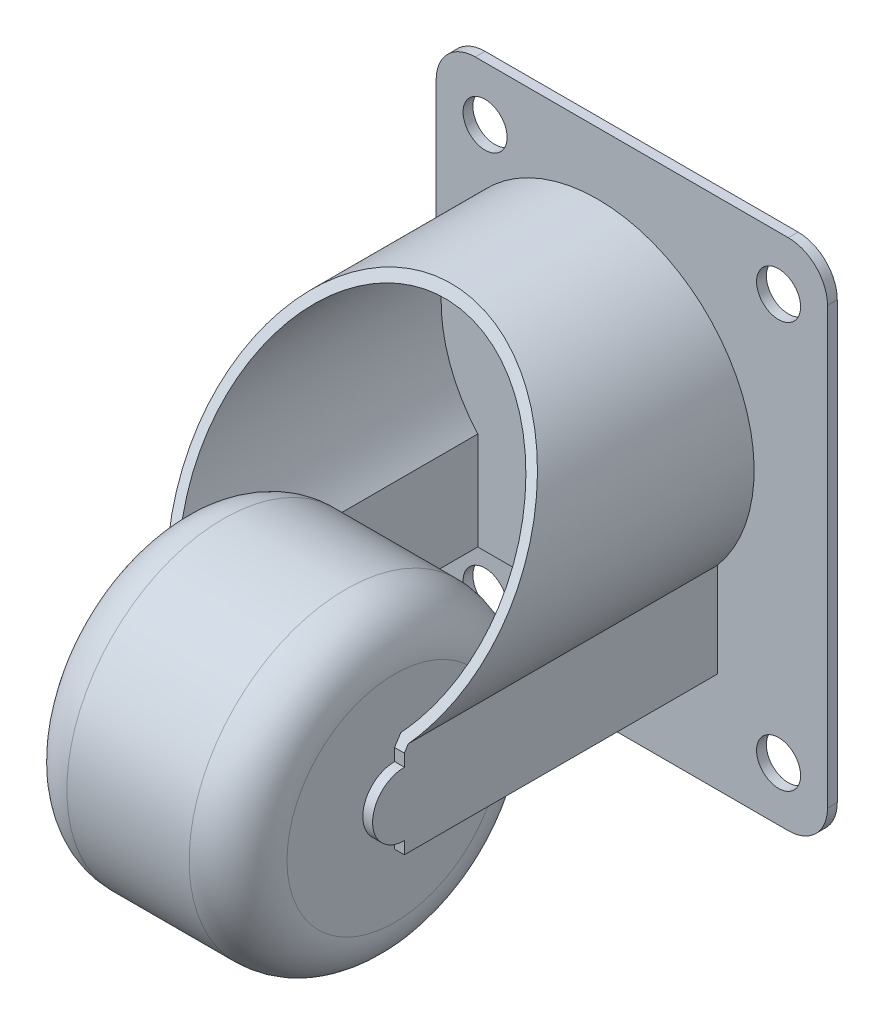
ISO-10303-21;
HEADER;
FILE_DESCRIPTION(('STEP AP214'),'2;1');
FILE_NAME('part.step','',(''),(''),'','','');
FILE_SCHEMA(('AUTOMOTIVE_DESIGN { 1 0 10303 214 1 1 1 1 }'));
ENDSEC;
DATA;
#1=APPLICATION_CONTEXT('core data for automotive mechanical design processes');
#2=APPLICATION_PROTOCOL_DEFINITION('international standard','automotive_design',2000,#1);
#3=PRODUCT_CONTEXT('',#1,'mechanical');
#4=PRODUCT('Part','Part','',(#3));
#5=PRODUCT_RELATED_PRODUCT_CATEGORY('part','',(#4));
#6=PRODUCT_DEFINITION_FORMATION('','',#4);
#7=PRODUCT_DEFINITION_CONTEXT('part definition',#1,'design');
#8=PRODUCT_DEFINITION('design','',#6,#7);
#9=PRODUCT_DEFINITION_SHAPE('','',#8);
#10=(LENGTH_UNIT() NAMED_UNIT(*) SI_UNIT(.MILLI.,.METRE.));
#11=(NAMED_UNIT(*) PLANE_ANGLE_UNIT() SI_UNIT($,.RADIAN.));
#12=(NAMED_UNIT(*) SI_UNIT($,.STERADIAN.) SOLID_ANGLE_UNIT());
#13=UNCERTAINTY_MEASURE_WITH_UNIT(LENGTH_MEASURE(1.E-05),#10,'distance_accuracy_value','');
#14=(GEOMETRIC_REPRESENTATION_CONTEXT(3) GLOBAL_UNCERTAINTY_ASSIGNED_CONTEXT((#13)) GLOBAL_UNIT_ASSIGNED_CONTEXT((#10,
#11,#12)) REPRESENTATION_CONTEXT('',''));
#15=CARTESIAN_POINT('',(0.,0.,0.));
#16=DIRECTION('',(0.,0.,1.));
#17=DIRECTION('',(1.,0.,0.));
#18=AXIS2_PLACEMENT_3D('',#15,#16,#17);
#19=CARTESIAN_POINT('',(0.,9.00000000000001,62.));
#20=DIRECTION('',(1.,0.,0.));
#21=DIRECTION('',(0.,0.,-1.));
#22=AXIS2_PLACEMENT_3D('',#19,#20,#21);
#23=CYLINDRICAL_SURFACE('',#22,32.);
#24=CARTESIAN_POINT('',(35.,9.00000000000001,62.));
#25=DIRECTION('',(1.,0.,0.));
#26=DIRECTION('',(0.,0.,-1.));
#27=AXIS2_PLACEMENT_3D('',#24,#25,#26);
#28=CIRCLE('',#27,32.);
#29=CARTESIAN_POINT('',(35.,9.00000000000001,30.));
#30=VERTEX_POINT('',#29);
#31=EDGE_CURVE('E662',#30,#30,#28,.T.);
#32=ORIENTED_EDGE('',*,*,#31,.F.);
#33=EDGE_LOOP('',(#32));
#34=FACE_BOUND('',#33,.T.);
#35=CARTESIAN_POINT('',(10.,9.00000000000001,62.));
#36=DIRECTION('',(1.,0.,0.));
#37=DIRECTION('',(0.,0.,-1.));
#38=AXIS2_PLACEMENT_3D('',#35,#36,#37);
#39=CIRCLE('',#38,32.);
#40=CARTESIAN_POINT('',(10.,9.00000000000001,30.));
#41=VERTEX_POINT('',#40);
#42=EDGE_CURVE('E180',#41,#41,#39,.F.);
#43=ORIENTED_EDGE('',*,*,#42,.F.);
#44=EDGE_LOOP('',(#43));
#45=FACE_BOUND('',#44,.T.);
#46=ADVANCED_FACE('F16',(#34,#45),#23,.T.);
#47=CARTESIAN_POINT('',(35.,9.00000000000001,62.));
#48=DIRECTION('',(1.,0.,0.));
#49=DIRECTION('',(0.,0.,-1.));
#50=AXIS2_PLACEMENT_3D('',#47,#48,#49);
#51=TOROIDAL_SURFACE('',#50,22.,10.);
#52=CARTESIAN_POINT('',(45.,9.00000000000001,62.));
#53=DIRECTION('',(-1.,0.,0.));
#54=DIRECTION('',(0.,-0.409090909090909,-0.912493631812942));
#55=AXIS2_PLACEMENT_3D('',#52,#53,#54);
#56=CIRCLE('',#55,22.);
#57=CARTESIAN_POINT('',(45.,9.00000000000001,84.));
#58=VERTEX_POINT('',#57);
#59=CARTESIAN_POINT('',(45.,0.,41.9251401001153));
#60=VERTEX_POINT('',#59);
#61=EDGE_CURVE('E206',#58,#60,#56,.F.);
#62=ORIENTED_EDGE('',*,*,#61,.F.);
#63=CARTESIAN_POINT('',(45.,9.00000000000001,62.));
#64=DIRECTION('',(-1.,0.,0.));
#65=DIRECTION('',(0.,0.,1.));
#66=AXIS2_PLACEMENT_3D('',#63,#64,#65);
#67=CIRCLE('',#66,22.);
#68=CARTESIAN_POINT('',(45.,20.,42.9474411167424));
#69=VERTEX_POINT('',#68);
#70=EDGE_CURVE('E167',#69,#58,#67,.F.);
#71=ORIENTED_EDGE('',*,*,#70,.F.);
#72=CARTESIAN_POINT('',(45.,9.00000000000001,62.));
#73=DIRECTION('',(-1.,0.,0.));
#74=DIRECTION('',(0.,0.500000000000001,-0.866025403784438));
#75=AXIS2_PLACEMENT_3D('',#72,#73,#74);
#76=CIRCLE('',#75,22.);
#77=CARTESIAN_POINT('',(45.,9.00000000000001,40.));
#78=VERTEX_POINT('',#77);
#79=EDGE_CURVE('E190',#78,#69,#76,.F.);
#80=ORIENTED_EDGE('',*,*,#79,.F.);
#81=CARTESIAN_POINT('',(45.,9.00000000000001,62.));
#82=DIRECTION('',(-1.,0.,0.));
#83=DIRECTION('',(0.,0.,-1.));
#84=AXIS2_PLACEMENT_3D('',#81,#82,#83);
#85=CIRCLE('',#84,22.);
#86=EDGE_CURVE('E197',#60,#78,#85,.F.);
#87=ORIENTED_EDGE('',*,*,#86,.F.);
#88=EDGE_LOOP('',(#62,#71,#80,#87));
#89=FACE_BOUND('',#88,.T.);
#90=ORIENTED_EDGE('',*,*,#31,.T.);
#91=EDGE_LOOP('',(#90));
#92=FACE_BOUND('',#91,.T.);
#93=ADVANCED_FACE('F204',(#89,#92),#51,.T.);
#94=CARTESIAN_POINT('',(10.,9.00000000000001,62.));
#95=DIRECTION('',(1.,0.,0.));
#96=DIRECTION('',(0.,0.,-1.));
#97=AXIS2_PLACEMENT_3D('',#94,#95,#96);
#98=TOROIDAL_SURFACE('',#97,22.,10.);
#99=ORIENTED_EDGE('',*,*,#42,.T.);
#100=EDGE_LOOP('',(#99));
#101=FACE_BOUND('',#100,.T.);
#102=CARTESIAN_POINT('',(0.,9.00000000000001,62.));
#103=DIRECTION('',(1.,0.,0.));
#104=DIRECTION('',(0.,0.5,-0.866025403784439));
#105=AXIS2_PLACEMENT_3D('',#102,#103,#104);
#106=CIRCLE('',#105,22.);
#107=CARTESIAN_POINT('',(0.,20.,42.9474411167423));
#108=VERTEX_POINT('',#107);
#109=CARTESIAN_POINT('',(0.,9.00000000000001,84.));
#110=VERTEX_POINT('',#109);
#111=EDGE_CURVE('E253',#108,#110,#106,.T.);
#112=ORIENTED_EDGE('',*,*,#111,.T.);
#113=CARTESIAN_POINT('',(0.,9.00000000000001,62.));
#114=DIRECTION('',(1.,0.,0.));
#115=DIRECTION('',(0.,0.,1.));
#116=AXIS2_PLACEMENT_3D('',#113,#114,#115);
#117=CIRCLE('',#116,22.);
#118=CARTESIAN_POINT('',(0.,0.,41.9251401001153));
#119=VERTEX_POINT('',#118);
#120=EDGE_CURVE('E388',#110,#119,#117,.T.);
#121=ORIENTED_EDGE('',*,*,#120,.T.);
#122=CARTESIAN_POINT('',(0.,9.00000000000001,62.));
#123=DIRECTION('',(1.,0.,0.));
#124=DIRECTION('',(0.,-0.409090909090909,-0.912493631812942));
#125=AXIS2_PLACEMENT_3D('',#122,#123,#124);
#126=CIRCLE('',#125,22.);
#127=CARTESIAN_POINT('',(0.,9.00000000000001,40.));
#128=VERTEX_POINT('',#127);
#129=EDGE_CURVE('E429',#128,#119,#126,.F.);
#130=ORIENTED_EDGE('',*,*,#129,.F.);
#131=CARTESIAN_POINT('',(0.,9.00000000000001,62.));
#132=DIRECTION('',(1.,0.,0.));
#133=DIRECTION('',(0.,0.,-1.));
#134=AXIS2_PLACEMENT_3D('',#131,#132,#133);
#135=CIRCLE('',#134,22.);
#136=EDGE_CURVE('E150',#108,#128,#135,.F.);
#137=ORIENTED_EDGE('',*,*,#136,.F.);
#138=EDGE_LOOP('',(#112,#121,#130,#137));
#139=FACE_BOUND('',#138,.T.);
#140=ADVANCED_FACE('F224',(#101,#139),#98,.T.);
#141=CARTESIAN_POINT('',(22.5,39.8431348329844,62.));
#142=DIRECTION('',(0.,0.,-1.));
#143=DIRECTION('',(-1.,0.,0.));
#144=AXIS2_PLACEMENT_3D('',#141,#142,#143);
#145=CYLINDRICAL_SURFACE('',#144,30.);
#146=CARTESIAN_POINT('',(22.5,39.8431348329844,48.1670416197123));
#147=DIRECTION('',(0.,-0.535023730317032,-0.844837030437023));
#148=DIRECTION('',(0.,0.844837030437023,-0.535023730317032));
#149=AXIS2_PLACEMENT_3D('',#146,#147,#148);
#150=ELLIPSE('',#149,35.5098071215953,30.);
#151=CARTESIAN_POINT('',(45.,20.,60.733427368731));
#152=VERTEX_POINT('',#151);
#153=CARTESIAN_POINT('',(0.,20.,60.7334273687311));
#154=VERTEX_POINT('',#153);
#155=EDGE_CURVE('E261',#152,#154,#150,.F.);
#156=ORIENTED_EDGE('',*,*,#155,.T.);
#157=DIRECTION('',(0.,0.,-1.));
#158=VECTOR('',#157,1.);
#159=CARTESIAN_POINT('',(0.,20.,62.));
#160=LINE('',#159,#158);
#161=EDGE_CURVE('E412',#154,#108,#160,.T.);
#162=ORIENTED_EDGE('',*,*,#161,.T.);
#163=DIRECTION('',(0.,0.,-1.));
#164=VECTOR('',#163,1.);
#165=CARTESIAN_POINT('',(0.,20.,62.));
#166=LINE('',#165,#164);
#167=CARTESIAN_POINT('',(0.,20.,0.));
#168=VERTEX_POINT('',#167);
#169=EDGE_CURVE('E441',#168,#108,#166,.F.);
#170=ORIENTED_EDGE('',*,*,#169,.F.);
#171=CARTESIAN_POINT('',(22.5,39.8431348329844,0.));
#172=DIRECTION('',(0.,0.,-1.));
#173=DIRECTION('',(-1.,0.,0.));
#174=AXIS2_PLACEMENT_3D('',#171,#172,#173);
#175=CIRCLE('',#174,30.);
#176=CARTESIAN_POINT('',(45.,20.,0.));
#177=VERTEX_POINT('',#176);
#178=EDGE_CURVE('E141',#168,#177,#175,.T.);
#179=ORIENTED_EDGE('',*,*,#178,.T.);
#180=DIRECTION('',(0.,0.,1.));
#181=VECTOR('',#180,1.);
#182=CARTESIAN_POINT('',(45.,20.,62.));
#183=LINE('',#182,#181);
#184=EDGE_CURVE('E183',#69,#177,#183,.F.);
#185=ORIENTED_EDGE('',*,*,#184,.F.);
#186=DIRECTION('',(0.,0.,-1.));
#187=VECTOR('',#186,1.);
#188=CARTESIAN_POINT('',(45.,20.,62.));
#189=LINE('',#188,#187);
#190=EDGE_CURVE('E172',#152,#69,#189,.T.);
#191=ORIENTED_EDGE('',*,*,#190,.F.);
#192=EDGE_LOOP('',(#156,#162,#170,#179,#185,#191));
#193=FACE_BOUND('',#192,.T.);
#194=ADVANCED_FACE('F185',(#193),#145,.F.);
#195=CARTESIAN_POINT('',(45.,9.00000000000001,62.));
#196=DIRECTION('',(1.,0.,0.));
#197=DIRECTION('',(0.,0.,-1.));
#198=AXIS2_PLACEMENT_3D('',#195,#196,#197);
#199=PLANE('',#198);
#200=ORIENTED_EDGE('',*,*,#70,.T.);
#201=ORIENTED_EDGE('',*,*,#61,.T.);
#202=DIRECTION('',(0.,0.,-1.));
#203=VECTOR('',#202,1.);
#204=CARTESIAN_POINT('',(45.,0.,62.));
#205=LINE('',#204,#203);
#206=CARTESIAN_POINT('',(45.,0.,62.));
#207=VERTEX_POINT('',#206);
#208=EDGE_CURVE('E304',#207,#60,#205,.T.);
#209=ORIENTED_EDGE('',*,*,#208,.F.);
#210=DIRECTION('',(0.,1.,0.));
#211=VECTOR('',#210,1.);
#212=CARTESIAN_POINT('',(45.,39.8431348329844,62.));
#213=LINE('',#212,#211);
#214=CARTESIAN_POINT('',(45.,2.50000000000001,62.));
#215=VERTEX_POINT('',#214);
#216=EDGE_CURVE('E272',#215,#207,#213,.F.);
#217=ORIENTED_EDGE('',*,*,#216,.F.);
#218=CARTESIAN_POINT('',(45.,9.00000000000001,62.));
#219=DIRECTION('',(1.,0.,0.));
#220=DIRECTION('',(0.,0.,-1.));
#221=AXIS2_PLACEMENT_3D('',#218,#219,#220);
#222=CIRCLE('',#221,6.5);
#223=CARTESIAN_POINT('',(45.,15.5,62.));
#224=VERTEX_POINT('',#223);
#225=EDGE_CURVE('E333',#224,#215,#222,.T.);
#226=ORIENTED_EDGE('',*,*,#225,.F.);
#227=DIRECTION('',(0.,1.,0.));
#228=VECTOR('',#227,1.);
#229=CARTESIAN_POINT('',(45.,39.8431348329844,62.));
#230=LINE('',#229,#228);
#231=CARTESIAN_POINT('',(45.,18.,62.));
#232=VERTEX_POINT('',#231);
#233=EDGE_CURVE('E265',#232,#224,#230,.F.);
#234=ORIENTED_EDGE('',*,*,#233,.F.);
#235=DIRECTION('',(0.,0.844837030437023,-0.535023730317032));
#236=VECTOR('',#235,1.);
#237=CARTESIAN_POINT('',(45.,18.,62.));
#238=LINE('',#237,#236);
#239=EDGE_CURVE('E177',#232,#152,#238,.T.);
#240=ORIENTED_EDGE('',*,*,#239,.T.);
#241=ORIENTED_EDGE('',*,*,#190,.T.);
#242=EDGE_LOOP('',(#200,#201,#209,#217,#226,#234,#240,#241));
#243=FACE_BOUND('',#242,.T.);
#244=ADVANCED_FACE('F174',(#243),#199,.T.);
#245=CARTESIAN_POINT('',(45.,0.,62.));
#246=DIRECTION('',(-1.,0.,0.));
#247=DIRECTION('',(0.,0.,1.));
#248=AXIS2_PLACEMENT_3D('',#245,#246,#247);
#249=PLANE('',#248);
#250=DIRECTION('',(0.,1.,0.));
#251=VECTOR('',#250,1.);
#252=CARTESIAN_POINT('',(45.,39.8431348329844,0.));
#253=LINE('',#252,#251);
#254=CARTESIAN_POINT('',(45.,0.,0.));
#255=VERTEX_POINT('',#254);
#256=EDGE_CURVE('E189',#177,#255,#253,.F.);
#257=ORIENTED_EDGE('',*,*,#256,.T.);
#258=DIRECTION('',(0.,0.,-1.));
#259=VECTOR('',#258,1.);
#260=CARTESIAN_POINT('',(45.,0.,62.));
#261=LINE('',#260,#259);
#262=EDGE_CURVE('E307',#60,#255,#261,.T.);
#263=ORIENTED_EDGE('',*,*,#262,.F.);
#264=ORIENTED_EDGE('',*,*,#86,.T.);
#265=ORIENTED_EDGE('',*,*,#79,.T.);
#266=ORIENTED_EDGE('',*,*,#184,.T.);
#267=EDGE_LOOP('',(#257,#263,#264,#265,#266));
#268=FACE_BOUND('',#267,.T.);
#269=ADVANCED_FACE('F194',(#268),#249,.T.);
#270=CARTESIAN_POINT('',(22.5,39.8431348329844,0.));
#271=DIRECTION('',(0.,0.,-1.));
#272=DIRECTION('',(-1.,0.,0.));
#273=AXIS2_PLACEMENT_3D('',#270,#271,#272);
#274=PLANE('',#273);
#275=DIRECTION('',(0.,1.,0.));
#276=VECTOR('',#275,1.);
#277=CARTESIAN_POINT('',(0.,0.,0.));
#278=LINE('',#277,#276);
#279=CARTESIAN_POINT('',(0.,0.,0.));
#280=VERTEX_POINT('',#279);
#281=EDGE_CURVE('E448',#280,#168,#278,.T.);
#282=ORIENTED_EDGE('',*,*,#281,.F.);
#283=DIRECTION('',(1.,0.,0.));
#284=VECTOR('',#283,1.);
#285=CARTESIAN_POINT('',(47.,0.,0.));
#286=LINE('',#285,#284);
#287=EDGE_CURVE('E321',#255,#280,#286,.F.);
#288=ORIENTED_EDGE('',*,*,#287,.F.);
#289=ORIENTED_EDGE('',*,*,#256,.F.);
#290=ORIENTED_EDGE('',*,*,#178,.F.);
#291=EDGE_LOOP('',(#282,#288,#289,#290));
#292=FACE_BOUND('',#291,.T.);
#293=ADVANCED_FACE('F843',(#292),#274,.F.);
#294=CARTESIAN_POINT('',(0.,0.,62.));
#295=DIRECTION('',(1.,0.,0.));
#296=DIRECTION('',(0.,0.,-1.));
#297=AXIS2_PLACEMENT_3D('',#294,#295,#296);
#298=PLANE('',#297);
#299=ORIENTED_EDGE('',*,*,#169,.T.);
#300=ORIENTED_EDGE('',*,*,#136,.T.);
#301=ORIENTED_EDGE('',*,*,#129,.T.);
#302=DIRECTION('',(0.,0.,-1.));
#303=VECTOR('',#302,1.);
#304=CARTESIAN_POINT('',(0.,0.,62.));
#305=LINE('',#304,#303);
#306=EDGE_CURVE('E382',#280,#119,#305,.F.);
#307=ORIENTED_EDGE('',*,*,#306,.F.);
#308=ORIENTED_EDGE('',*,*,#281,.T.);
#309=EDGE_LOOP('',(#299,#300,#301,#307,#308));
#310=FACE_BOUND('',#309,.T.);
#311=ADVANCED_FACE('F405',(#310),#298,.T.);
#312=CARTESIAN_POINT('',(0.,9.00000000000001,62.));
#313=DIRECTION('',(1.,0.,0.));
#314=DIRECTION('',(0.,0.,-1.));
#315=AXIS2_PLACEMENT_3D('',#312,#313,#314);
#316=PLANE('',#315);
#317=ORIENTED_EDGE('',*,*,#161,.F.);
#318=DIRECTION('',(0.,0.844837030437023,-0.535023730317032));
#319=VECTOR('',#318,1.);
#320=CARTESIAN_POINT('',(0.,18.,62.));
#321=LINE('',#320,#319);
#322=CARTESIAN_POINT('',(0.,18.,62.));
#323=VERTEX_POINT('',#322);
#324=EDGE_CURVE('E347',#154,#323,#321,.F.);
#325=ORIENTED_EDGE('',*,*,#324,.T.);
#326=DIRECTION('',(0.,1.,0.));
#327=VECTOR('',#326,1.);
#328=CARTESIAN_POINT('',(0.,39.8431348329844,62.));
#329=LINE('',#328,#327);
#330=CARTESIAN_POINT('',(0.,15.5,62.));
#331=VERTEX_POINT('',#330);
#332=EDGE_CURVE('E258',#331,#323,#329,.T.);
#333=ORIENTED_EDGE('',*,*,#332,.F.);
#334=CARTESIAN_POINT('',(0.,9.00000000000001,62.));
#335=DIRECTION('',(1.,0.,0.));
#336=DIRECTION('',(0.,0.,-1.));
#337=AXIS2_PLACEMENT_3D('',#334,#335,#336);
#338=CIRCLE('',#337,6.5);
#339=CARTESIAN_POINT('',(0.,2.50000000000001,62.));
#340=VERTEX_POINT('',#339);
#341=EDGE_CURVE('E375',#340,#331,#338,.F.);
#342=ORIENTED_EDGE('',*,*,#341,.F.);
#343=DIRECTION('',(0.,1.,0.));
#344=VECTOR('',#343,1.);
#345=CARTESIAN_POINT('',(0.,39.8431348329844,62.));
#346=LINE('',#345,#344);
#347=CARTESIAN_POINT('',(0.,0.,62.));
#348=VERTEX_POINT('',#347);
#349=EDGE_CURVE('E361',#348,#340,#346,.T.);
#350=ORIENTED_EDGE('',*,*,#349,.F.);
#351=DIRECTION('',(0.,0.,-1.));
#352=VECTOR('',#351,1.);
#353=CARTESIAN_POINT('',(0.,0.,62.));
#354=LINE('',#353,#352);
#355=EDGE_CURVE('E370',#119,#348,#354,.F.);
#356=ORIENTED_EDGE('',*,*,#355,.F.);
#357=ORIENTED_EDGE('',*,*,#120,.F.);
#358=ORIENTED_EDGE('',*,*,#111,.F.);
#359=EDGE_LOOP('',(#317,#325,#333,#342,#350,#356,#357,#358));
#360=FACE_BOUND('',#359,.T.);
#361=ADVANCED_FACE('F394',(#360),#316,.F.);
#362=CARTESIAN_POINT('',(-20.3847763108502,9.00000000000001,62.));
#363=DIRECTION('',(1.,0.,0.));
#364=DIRECTION('',(0.,0.,-1.));
#365=AXIS2_PLACEMENT_3D('',#362,#363,#364);
#366=CYLINDRICAL_SURFACE('',#365,6.5);
#367=DIRECTION('',(1.,0.,0.));
#368=VECTOR('',#367,1.);
#369=CARTESIAN_POINT('',(22.5,15.5,62.));
#370=LINE('',#369,#368);
#371=CARTESIAN_POINT('',(-2.,15.5,62.));
#372=VERTEX_POINT('',#371);
#373=EDGE_CURVE('E262',#372,#331,#370,.T.);
#374=ORIENTED_EDGE('',*,*,#373,.F.);
#375=CARTESIAN_POINT('',(-2.,9.00000000000001,62.));
#376=DIRECTION('',(1.,0.,0.));
#377=DIRECTION('',(0.,0.,-1.));
#378=AXIS2_PLACEMENT_3D('',#375,#376,#377);
#379=CIRCLE('',#378,6.5);
#380=CARTESIAN_POINT('',(-2.,2.50000000000001,62.));
#381=VERTEX_POINT('',#380);
#382=EDGE_CURVE('E369',#372,#381,#379,.T.);
#383=ORIENTED_EDGE('',*,*,#382,.T.);
#384=DIRECTION('',(1.,0.,0.));
#385=VECTOR('',#384,1.);
#386=CARTESIAN_POINT('',(22.5,2.50000000000001,62.));
#387=LINE('',#386,#385);
#388=EDGE_CURVE('E373',#340,#381,#387,.F.);
#389=ORIENTED_EDGE('',*,*,#388,.F.);
#390=ORIENTED_EDGE('',*,*,#341,.T.);
#391=EDGE_LOOP('',(#374,#383,#389,#390));
#392=FACE_BOUND('',#391,.T.);
#393=ADVANCED_FACE('F404',(#392),#366,.T.);
#394=CARTESIAN_POINT('',(22.5,39.8431348329844,62.));
#395=DIRECTION('',(0.,0.,1.));
#396=DIRECTION('',(1.,0.,0.));
#397=AXIS2_PLACEMENT_3D('',#394,#395,#396);
#398=PLANE('',#397);
#399=DIRECTION('',(1.,0.,0.));
#400=VECTOR('',#399,1.);
#401=CARTESIAN_POINT('',(47.,0.,62.));
#402=LINE('',#401,#400);
#403=CARTESIAN_POINT('',(-2.,0.,62.));
#404=VERTEX_POINT('',#403);
#405=EDGE_CURVE('E366',#348,#404,#402,.F.);
#406=ORIENTED_EDGE('',*,*,#405,.F.);
#407=ORIENTED_EDGE('',*,*,#349,.T.);
#408=ORIENTED_EDGE('',*,*,#388,.T.);
#409=DIRECTION('',(0.,1.,0.));
#410=VECTOR('',#409,1.);
#411=CARTESIAN_POINT('',(-2.,0.,62.));
#412=LINE('',#411,#410);
#413=EDGE_CURVE('E561',#381,#404,#412,.F.);
#414=ORIENTED_EDGE('',*,*,#413,.T.);
#415=EDGE_LOOP('',(#406,#407,#408,#414));
#416=FACE_BOUND('',#415,.T.);
#417=ADVANCED_FACE('F763',(#416),#398,.T.);
#418=CARTESIAN_POINT('',(22.5,39.8431348329844,62.));
#419=DIRECTION('',(0.,0.,1.));
#420=DIRECTION('',(1.,0.,0.));
#421=AXIS2_PLACEMENT_3D('',#418,#419,#420);
#422=PLANE('',#421);
#423=DIRECTION('',(1.,0.,0.));
#424=VECTOR('',#423,1.);
#425=CARTESIAN_POINT('',(-9.50000000000001,18.,62.));
#426=LINE('',#425,#424);
#427=CARTESIAN_POINT('',(-2.,18.,62.));
#428=VERTEX_POINT('',#427);
#429=EDGE_CURVE('E344',#323,#428,#426,.F.);
#430=ORIENTED_EDGE('',*,*,#429,.T.);
#431=DIRECTION('',(0.,1.,0.));
#432=VECTOR('',#431,1.);
#433=CARTESIAN_POINT('',(-2.,0.,62.));
#434=LINE('',#433,#432);
#435=EDGE_CURVE('E355',#428,#372,#434,.F.);
#436=ORIENTED_EDGE('',*,*,#435,.T.);
#437=ORIENTED_EDGE('',*,*,#373,.T.);
#438=ORIENTED_EDGE('',*,*,#332,.T.);
#439=EDGE_LOOP('',(#430,#436,#437,#438));
#440=FACE_BOUND('',#439,.T.);
#441=ADVANCED_FACE('F586',(#440),#422,.T.);
#442=CARTESIAN_POINT('',(-9.50000000000001,18.,62.));
#443=DIRECTION('',(0.,-0.535023730317032,-0.844837030437023));
#444=DIRECTION('',(0.,0.844837030437023,-0.535023730317032));
#445=AXIS2_PLACEMENT_3D('',#442,#443,#444);
#446=PLANE('',#445);
#447=DIRECTION('',(1.,0.,0.));
#448=VECTOR('',#447,1.);
#449=CARTESIAN_POINT('',(22.5,18.,62.));
#450=LINE('',#449,#448);
#451=CARTESIAN_POINT('',(47.,18.,62.));
#452=VERTEX_POINT('',#451);
#453=EDGE_CURVE('E269',#452,#232,#450,.F.);
#454=ORIENTED_EDGE('',*,*,#453,.F.);
#455=DIRECTION('',(0.,0.844837030437023,-0.535023730317032));
#456=VECTOR('',#455,1.);
#457=CARTESIAN_POINT('',(47.,18.,62.));
#458=LINE('',#457,#456);
#459=CARTESIAN_POINT('',(47.,19.2579459827456,61.2033600233199));
#460=VERTEX_POINT('',#459);
#461=EDGE_CURVE('E339',#460,#452,#458,.F.);
#462=ORIENTED_EDGE('',*,*,#461,.F.);
#463=CARTESIAN_POINT('',(22.5,39.8431348329844,48.1670416197123));
#464=DIRECTION('',(0.,-0.535023730317032,-0.844837030437023));
#465=DIRECTION('',(0.,0.844837030437023,-0.535023730317032));
#466=AXIS2_PLACEMENT_3D('',#463,#464,#465);
#467=ELLIPSE('',#466,37.8771275963683,32.);
#468=CARTESIAN_POINT('',(-2.,19.2579459827455,61.2033600233199));
#469=VERTEX_POINT('',#468);
#470=EDGE_CURVE('E556',#469,#460,#467,.T.);
#471=ORIENTED_EDGE('',*,*,#470,.F.);
#472=DIRECTION('',(0.,-0.844837030437024,0.535023730317031));
#473=VECTOR('',#472,1.);
#474=CARTESIAN_POINT('',(-2.,19.2579459827455,61.2033600233199));
#475=LINE('',#474,#473);
#476=EDGE_CURVE('E352',#469,#428,#475,.T.);
#477=ORIENTED_EDGE('',*,*,#476,.T.);
#478=ORIENTED_EDGE('',*,*,#429,.F.);
#479=ORIENTED_EDGE('',*,*,#324,.F.);
#480=ORIENTED_EDGE('',*,*,#155,.F.);
#481=ORIENTED_EDGE('',*,*,#239,.F.);
#482=EDGE_LOOP('',(#454,#462,#471,#477,#478,#479,#480,#481));
#483=FACE_BOUND('',#482,.T.);
#484=ADVANCED_FACE('F581',(#483),#446,.F.);
#485=CARTESIAN_POINT('',(-20.3847763108502,9.00000000000001,62.));
#486=DIRECTION('',(1.,0.,0.));
#487=DIRECTION('',(0.,0.,-1.));
#488=AXIS2_PLACEMENT_3D('',#485,#486,#487);
#489=CYLINDRICAL_SURFACE('',#488,6.5);
#490=CARTESIAN_POINT('',(47.,9.00000000000001,62.));
#491=DIRECTION('',(1.,0.,0.));
#492=DIRECTION('',(0.,0.,-1.));
#493=AXIS2_PLACEMENT_3D('',#490,#491,#492);
#494=CIRCLE('',#493,6.5);
#495=CARTESIAN_POINT('',(47.,2.50000000000001,62.));
#496=VERTEX_POINT('',#495);
#497=CARTESIAN_POINT('',(47.,15.5,62.));
#498=VERTEX_POINT('',#497);
#499=EDGE_CURVE('E594',#496,#498,#494,.F.);
#500=ORIENTED_EDGE('',*,*,#499,.T.);
#501=DIRECTION('',(1.,0.,0.));
#502=VECTOR('',#501,1.);
#503=CARTESIAN_POINT('',(22.5,15.5,62.));
#504=LINE('',#503,#502);
#505=EDGE_CURVE('E331',#224,#498,#504,.T.);
#506=ORIENTED_EDGE('',*,*,#505,.F.);
#507=ORIENTED_EDGE('',*,*,#225,.T.);
#508=DIRECTION('',(1.,0.,0.));
#509=VECTOR('',#508,1.);
#510=CARTESIAN_POINT('',(22.5,2.50000000000001,62.));
#511=LINE('',#510,#509);
#512=EDGE_CURVE('E268',#496,#215,#511,.F.);
#513=ORIENTED_EDGE('',*,*,#512,.F.);
#514=EDGE_LOOP('',(#500,#506,#507,#513));
#515=FACE_BOUND('',#514,.T.);
#516=ADVANCED_FACE('F756',(#515),#489,.T.);
#517=CARTESIAN_POINT('',(22.5,39.8431348329844,62.));
#518=DIRECTION('',(0.,0.,1.));
#519=DIRECTION('',(1.,0.,0.));
#520=AXIS2_PLACEMENT_3D('',#517,#518,#519);
#521=PLANE('',#520);
#522=ORIENTED_EDGE('',*,*,#453,.T.);
#523=ORIENTED_EDGE('',*,*,#233,.T.);
#524=ORIENTED_EDGE('',*,*,#505,.T.);
#525=DIRECTION('',(0.,1.,0.));
#526=VECTOR('',#525,1.);
#527=CARTESIAN_POINT('',(47.,0.,62.));
#528=LINE('',#527,#526);
#529=EDGE_CURVE('E596',#498,#452,#528,.T.);
#530=ORIENTED_EDGE('',*,*,#529,.T.);
#531=EDGE_LOOP('',(#522,#523,#524,#530));
#532=FACE_BOUND('',#531,.T.);
#533=ADVANCED_FACE('F752',(#532),#521,.T.);
#534=CARTESIAN_POINT('',(22.5,39.8431348329844,62.));
#535=DIRECTION('',(0.,0.,1.));
#536=DIRECTION('',(1.,0.,0.));
#537=AXIS2_PLACEMENT_3D('',#534,#535,#536);
#538=PLANE('',#537);
#539=DIRECTION('',(1.,0.,0.));
#540=VECTOR('',#539,1.);
#541=CARTESIAN_POINT('',(47.,0.,62.));
#542=LINE('',#541,#540);
#543=CARTESIAN_POINT('',(47.,0.,62.));
#544=VERTEX_POINT('',#543);
#545=EDGE_CURVE('E275',#544,#207,#542,.F.);
#546=ORIENTED_EDGE('',*,*,#545,.F.);
#547=DIRECTION('',(0.,1.,0.));
#548=VECTOR('',#547,1.);
#549=CARTESIAN_POINT('',(47.,0.,62.));
#550=LINE('',#549,#548);
#551=EDGE_CURVE('E528',#544,#496,#550,.T.);
#552=ORIENTED_EDGE('',*,*,#551,.T.);
#553=ORIENTED_EDGE('',*,*,#512,.T.);
#554=ORIENTED_EDGE('',*,*,#216,.T.);
#555=EDGE_LOOP('',(#546,#552,#553,#554));
#556=FACE_BOUND('',#555,.T.);
#557=ADVANCED_FACE('F749',(#556),#538,.T.);
#558=CARTESIAN_POINT('',(47.,0.,62.));
#559=DIRECTION('',(0.,-1.,0.));
#560=DIRECTION('',(0.,0.,-1.));
#561=AXIS2_PLACEMENT_3D('',#558,#559,#560);
#562=PLANE('',#561);
#563=ORIENTED_EDGE('',*,*,#405,.T.);
#564=DIRECTION('',(0.,0.,-1.));
#565=VECTOR('',#564,1.);
#566=CARTESIAN_POINT('',(-2.,0.,62.));
#567=LINE('',#566,#565);
#568=CARTESIAN_POINT('',(-2.,0.,-2.));
#569=VERTEX_POINT('',#568);
#570=EDGE_CURVE('E356',#404,#569,#567,.T.);
#571=ORIENTED_EDGE('',*,*,#570,.T.);
#572=DIRECTION('',(-1.,0.,0.));
#573=VECTOR('',#572,1.);
#574=CARTESIAN_POINT('',(22.5,0.,-2.));
#575=LINE('',#574,#573);
#576=CARTESIAN_POINT('',(47.,0.,-2.));
#577=VERTEX_POINT('',#576);
#578=EDGE_CURVE('E536',#577,#569,#575,.T.);
#579=ORIENTED_EDGE('',*,*,#578,.F.);
#580=DIRECTION('',(0.,0.,1.));
#581=VECTOR('',#580,1.);
#582=CARTESIAN_POINT('',(47.,0.,62.));
#583=LINE('',#582,#581);
#584=EDGE_CURVE('E522',#577,#544,#583,.T.);
#585=ORIENTED_EDGE('',*,*,#584,.T.);
#586=ORIENTED_EDGE('',*,*,#545,.T.);
#587=ORIENTED_EDGE('',*,*,#208,.T.);
#588=ORIENTED_EDGE('',*,*,#262,.T.);
#589=ORIENTED_EDGE('',*,*,#287,.T.);
#590=ORIENTED_EDGE('',*,*,#306,.T.);
#591=ORIENTED_EDGE('',*,*,#355,.T.);
#592=EDGE_LOOP('',(#563,#571,#579,#585,#586,#587,#588,#589,#590,#591));
#593=FACE_BOUND('',#592,.T.);
#594=ADVANCED_FACE('F501',(#593),#562,.T.);
#595=CARTESIAN_POINT('',(-2.,0.,62.));
#596=DIRECTION('',(1.,0.,0.));
#597=DIRECTION('',(0.,0.,-1.));
#598=AXIS2_PLACEMENT_3D('',#595,#596,#597);
#599=PLANE('',#598);
#600=ORIENTED_EDGE('',*,*,#476,.F.);
#601=DIRECTION('',(0.,0.,-1.));
#602=VECTOR('',#601,1.);
#603=CARTESIAN_POINT('',(-2.00000000000001,19.2579459827455,62.));
#604=LINE('',#603,#602);
#605=CARTESIAN_POINT('',(-2.,19.2579459827455,-2.));
#606=VERTEX_POINT('',#605);
#607=EDGE_CURVE('E553',#606,#469,#604,.F.);
#608=ORIENTED_EDGE('',*,*,#607,.F.);
#609=DIRECTION('',(0.,1.,0.));
#610=VECTOR('',#609,1.);
#611=CARTESIAN_POINT('',(-2.,39.8431348329844,-2.));
#612=LINE('',#611,#610);
#613=EDGE_CURVE('E544',#569,#606,#612,.T.);
#614=ORIENTED_EDGE('',*,*,#613,.F.);
#615=ORIENTED_EDGE('',*,*,#570,.F.);
#616=ORIENTED_EDGE('',*,*,#413,.F.);
#617=ORIENTED_EDGE('',*,*,#382,.F.);
#618=ORIENTED_EDGE('',*,*,#435,.F.);
#619=EDGE_LOOP('',(#600,#608,#614,#615,#616,#617,#618));
#620=FACE_BOUND('',#619,.T.);
#621=ADVANCED_FACE('F590',(#620),#599,.F.);
#622=CARTESIAN_POINT('',(22.5,39.8431348329844,62.));
#623=DIRECTION('',(0.,0.,-1.));
#624=DIRECTION('',(-1.,0.,0.));
#625=AXIS2_PLACEMENT_3D('',#622,#623,#624);
#626=CYLINDRICAL_SURFACE('',#625,32.);
#627=DIRECTION('',(0.,0.,1.));
#628=VECTOR('',#627,1.);
#629=CARTESIAN_POINT('',(47.,19.2579459827456,62.));
#630=LINE('',#629,#628);
#631=CARTESIAN_POINT('',(47.,19.2579459827456,-2.));
#632=VERTEX_POINT('',#631);
#633=EDGE_CURVE('E530',#460,#632,#630,.F.);
#634=ORIENTED_EDGE('',*,*,#633,.T.);
#635=CARTESIAN_POINT('',(22.5,39.8431348329844,-2.));
#636=DIRECTION('',(0.,0.,-1.));
#637=DIRECTION('',(-1.,0.,0.));
#638=AXIS2_PLACEMENT_3D('',#635,#636,#637);
#639=CIRCLE('',#638,32.);
#640=EDGE_CURVE('E538',#606,#632,#639,.T.);
#641=ORIENTED_EDGE('',*,*,#640,.F.);
#642=ORIENTED_EDGE('',*,*,#607,.T.);
#643=ORIENTED_EDGE('',*,*,#470,.T.);
#644=EDGE_LOOP('',(#634,#641,#642,#643));
#645=FACE_BOUND('',#644,.T.);
#646=ADVANCED_FACE('F742',(#645),#626,.T.);
#647=CARTESIAN_POINT('',(47.,0.,62.));
#648=DIRECTION('',(-1.,0.,0.));
#649=DIRECTION('',(0.,0.,1.));
#650=AXIS2_PLACEMENT_3D('',#647,#648,#649);
#651=PLANE('',#650);
#652=ORIENTED_EDGE('',*,*,#584,.F.);
#653=DIRECTION('',(0.,1.,0.));
#654=VECTOR('',#653,1.);
#655=CARTESIAN_POINT('',(47.,39.8431348329844,-2.));
#656=LINE('',#655,#654);
#657=EDGE_CURVE('E526',#632,#577,#656,.F.);
#658=ORIENTED_EDGE('',*,*,#657,.F.);
#659=ORIENTED_EDGE('',*,*,#633,.F.);
#660=ORIENTED_EDGE('',*,*,#461,.T.);
#661=ORIENTED_EDGE('',*,*,#529,.F.);
#662=ORIENTED_EDGE('',*,*,#499,.F.);
#663=ORIENTED_EDGE('',*,*,#551,.F.);
#664=EDGE_LOOP('',(#652,#658,#659,#660,#661,#662,#663));
#665=FACE_BOUND('',#664,.T.);
#666=ADVANCED_FACE('F524',(#665),#651,.F.);
#667=CARTESIAN_POINT('',(22.5,39.8431348329844,-2.));
#668=DIRECTION('',(0.,0.,-1.));
#669=DIRECTION('',(-1.,0.,0.));
#670=AXIS2_PLACEMENT_3D('',#667,#668,#669);
#671=PLANE('',#670);
#672=ORIENTED_EDGE('',*,*,#640,.T.);
#673=ORIENTED_EDGE('',*,*,#657,.T.);
#674=ORIENTED_EDGE('',*,*,#578,.T.);
#675=ORIENTED_EDGE('',*,*,#613,.T.);
#676=EDGE_LOOP('',(#672,#673,#674,#675));
#677=FACE_BOUND('',#676,.T.);
#678=CARTESIAN_POINT('',(22.5,25.,-2.));
#679=DIRECTION('',(0.,0.,1.));
#680=DIRECTION('',(1.,0.,0.));
#681=AXIS2_PLACEMENT_3D('',#678,#679,#680);
#682=CIRCLE('',#681,10.);
#683=CARTESIAN_POINT('',(32.5,25.,-2.));
#684=VERTEX_POINT('',#683);
#685=EDGE_CURVE('E540',#684,#684,#682,.F.);
#686=ORIENTED_EDGE('',*,*,#685,.F.);
#687=EDGE_LOOP('',(#686));
#688=FACE_BOUND('',#687,.T.);
#689=ADVANCED_FACE('F533',(#677,#688),#671,.T.);
#690=CARTESIAN_POINT('',(22.5,25.,-9.00000000000001));
#691=DIRECTION('',(0.,0.,1.));
#692=DIRECTION('',(1.,0.,0.));
#693=AXIS2_PLACEMENT_3D('',#690,#691,#692);
#694=CYLINDRICAL_SURFACE('',#693,10.);
#695=ORIENTED_EDGE('',*,*,#685,.T.);
#696=EDGE_LOOP('',(#695));
#697=FACE_BOUND('',#696,.T.);
#698=CARTESIAN_POINT('',(22.5,25.,-9.00000000000001));
#699=DIRECTION('',(0.,0.,1.));
#700=DIRECTION('',(1.,0.,0.));
#701=AXIS2_PLACEMENT_3D('',#698,#699,#700);
#702=CIRCLE('',#701,10.);
#703=CARTESIAN_POINT('',(32.5,25.,-9.00000000000001));
#704=VERTEX_POINT('',#703);
#705=EDGE_CURVE('E606',#704,#704,#702,.F.);
#706=ORIENTED_EDGE('',*,*,#705,.F.);
#707=EDGE_LOOP('',(#706));
#708=FACE_BOUND('',#707,.T.);
#709=ADVANCED_FACE('F733',(#697,#708),#694,.T.);
#710=CARTESIAN_POINT('',(0.,0.,-9.00000000000001));
#711=DIRECTION('',(0.,0.,1.));
#712=DIRECTION('',(1.,0.,0.));
#713=AXIS2_PLACEMENT_3D('',#710,#711,#712);
#714=PLANE('',#713);
#715=DIRECTION('',(1.,0.,0.));
#716=VECTOR('',#715,1.);
#717=CARTESIAN_POINT('',(62.5,77.5,-9.00000000000001));
#718=LINE('',#717,#716);
#719=CARTESIAN_POINT('',(54.5,77.5,-9.00000000000001));
#720=VERTEX_POINT('',#719);
#721=CARTESIAN_POINT('',(-9.50000000000002,77.5,-9.00000000000001));
#722=VERTEX_POINT('',#721);
#723=EDGE_CURVE('E627',#720,#722,#718,.F.);
#724=ORIENTED_EDGE('',*,*,#723,.T.);
#725=CARTESIAN_POINT('',(-9.50000000000002,69.5,-9.00000000000001));
#726=DIRECTION('',(0.,0.,1.));
#727=DIRECTION('',(1.,0.,0.));
#728=AXIS2_PLACEMENT_3D('',#725,#726,#727);
#729=CIRCLE('',#728,8.);
#730=CARTESIAN_POINT('',(-17.5,69.5,-9.00000000000001));
#731=VERTEX_POINT('',#730);
#732=EDGE_CURVE('E624',#731,#722,#729,.F.);
#733=ORIENTED_EDGE('',*,*,#732,.F.);
#734=DIRECTION('',(0.,1.,0.));
#735=VECTOR('',#734,1.);
#736=CARTESIAN_POINT('',(-17.5,-27.5,-9.00000000000001));
#737=LINE('',#736,#735);
#738=CARTESIAN_POINT('',(-17.5,-19.5,-9.00000000000001));
#739=VERTEX_POINT('',#738);
#740=EDGE_CURVE('E631',#731,#739,#737,.F.);
#741=ORIENTED_EDGE('',*,*,#740,.T.);
#742=CARTESIAN_POINT('',(-9.50000000000001,-19.5,-9.00000000000001));
#743=DIRECTION('',(0.,0.,1.));
#744=DIRECTION('',(1.,0.,0.));
#745=AXIS2_PLACEMENT_3D('',#742,#743,#744);
#746=CIRCLE('',#745,8.);
#747=CARTESIAN_POINT('',(-9.50000000000001,-27.5,-9.00000000000001));
#748=VERTEX_POINT('',#747);
#749=EDGE_CURVE('E628',#748,#739,#746,.F.);
#750=ORIENTED_EDGE('',*,*,#749,.F.);
#751=DIRECTION('',(1.,0.,0.));
#752=VECTOR('',#751,1.);
#753=CARTESIAN_POINT('',(62.5,-27.5,-9.00000000000001));
#754=LINE('',#753,#752);
#755=CARTESIAN_POINT('',(54.5,-27.5,-9.00000000000001));
#756=VERTEX_POINT('',#755);
#757=EDGE_CURVE('E635',#748,#756,#754,.T.);
#758=ORIENTED_EDGE('',*,*,#757,.T.);
#759=CARTESIAN_POINT('',(54.5,-19.5,-9.00000000000001));
#760=DIRECTION('',(0.,0.,1.));
#761=DIRECTION('',(1.,0.,0.));
#762=AXIS2_PLACEMENT_3D('',#759,#760,#761);
#763=CIRCLE('',#762,8.);
#764=CARTESIAN_POINT('',(62.5,-19.5,-9.00000000000001));
#765=VERTEX_POINT('',#764);
#766=EDGE_CURVE('E632',#765,#756,#763,.F.);
#767=ORIENTED_EDGE('',*,*,#766,.F.);
#768=DIRECTION('',(0.,1.,0.));
#769=VECTOR('',#768,1.);
#770=CARTESIAN_POINT('',(62.5,-27.5,-9.00000000000001));
#771=LINE('',#770,#769);
#772=CARTESIAN_POINT('',(62.5,69.5,-9.00000000000001));
#773=VERTEX_POINT('',#772);
#774=EDGE_CURVE('E640',#765,#773,#771,.T.);
#775=ORIENTED_EDGE('',*,*,#774,.T.);
#776=CARTESIAN_POINT('',(54.5,69.5,-9.00000000000001));
#777=DIRECTION('',(0.,0.,1.));
#778=DIRECTION('',(1.,0.,0.));
#779=AXIS2_PLACEMENT_3D('',#776,#777,#778);
#780=CIRCLE('',#779,8.);
#781=EDGE_CURVE('E621',#720,#773,#780,.F.);
#782=ORIENTED_EDGE('',*,*,#781,.F.);
#783=EDGE_LOOP('',(#724,#733,#741,#750,#758,#767,#775,#782));
#784=FACE_BOUND('',#783,.T.);
#785=ORIENTED_EDGE('',*,*,#705,.T.);
#786=EDGE_LOOP('',(#785));
#787=FACE_BOUND('',#786,.T.);
#788=CARTESIAN_POINT('',(52.5,66.5,-9.00000000000001));
#789=DIRECTION('',(0.,0.,-1.));
#790=DIRECTION('',(-1.,0.,0.));
#791=AXIS2_PLACEMENT_3D('',#788,#789,#790);
#792=CIRCLE('',#791,4.5);
#793=CARTESIAN_POINT('',(48.,66.5,-9.00000000000001));
#794=VERTEX_POINT('',#793);
#795=EDGE_CURVE('E618',#794,#794,#792,.T.);
#796=ORIENTED_EDGE('',*,*,#795,.T.);
#797=EDGE_LOOP('',(#796));
#798=FACE_BOUND('',#797,.T.);
#799=CARTESIAN_POINT('',(-7.49999999999999,66.5,-9.00000000000001));
#800=DIRECTION('',(0.,0.,-1.));
#801=DIRECTION('',(-1.,0.,0.));
#802=AXIS2_PLACEMENT_3D('',#799,#800,#801);
#803=CIRCLE('',#802,4.5);
#804=CARTESIAN_POINT('',(-12.,66.5,-9.00000000000001));
#805=VERTEX_POINT('',#804);
#806=EDGE_CURVE('E615',#805,#805,#803,.T.);
#807=ORIENTED_EDGE('',*,*,#806,.T.);
#808=EDGE_LOOP('',(#807));
#809=FACE_BOUND('',#808,.T.);
#810=CARTESIAN_POINT('',(-7.49999999999999,-16.5,-9.00000000000001));
#811=DIRECTION('',(0.,0.,-1.));
#812=DIRECTION('',(-1.,0.,0.));
#813=AXIS2_PLACEMENT_3D('',#810,#811,#812);
#814=CIRCLE('',#813,4.5);
#815=CARTESIAN_POINT('',(-12.,-16.5,-9.00000000000001));
#816=VERTEX_POINT('',#815);
#817=EDGE_CURVE('E612',#816,#816,#814,.T.);
#818=ORIENTED_EDGE('',*,*,#817,.T.);
#819=EDGE_LOOP('',(#818));
#820=FACE_BOUND('',#819,.T.);
#821=CARTESIAN_POINT('',(52.5,-16.5,-9.00000000000001));
#822=DIRECTION('',(0.,0.,-1.));
#823=DIRECTION('',(-1.,0.,0.));
#824=AXIS2_PLACEMENT_3D('',#821,#822,#823);
#825=CIRCLE('',#824,4.5);
#826=CARTESIAN_POINT('',(48.,-16.5,-9.00000000000001));
#827=VERTEX_POINT('',#826);
#828=EDGE_CURVE('E609',#827,#827,#825,.T.);
#829=ORIENTED_EDGE('',*,*,#828,.T.);
#830=EDGE_LOOP('',(#829));
#831=FACE_BOUND('',#830,.T.);
#832=ADVANCED_FACE('F729',(#784,#787,#798,#809,#820,#831),#714,.T.);
#833=CARTESIAN_POINT('',(52.5,-16.5,-9.00000000000001));
#834=DIRECTION('',(0.,0.,-1.));
#835=DIRECTION('',(-1.,0.,0.));
#836=AXIS2_PLACEMENT_3D('',#833,#834,#835);
#837=CYLINDRICAL_SURFACE('',#836,4.5);
#838=ORIENTED_EDGE('',*,*,#828,.F.);
#839=EDGE_LOOP('',(#838));
#840=FACE_BOUND('',#839,.T.);
#841=CARTESIAN_POINT('',(52.5,-16.5,-11.));
#842=DIRECTION('',(0.,0.,-1.));
#843=DIRECTION('',(-1.,0.,0.));
#844=AXIS2_PLACEMENT_3D('',#841,#842,#843);
#845=CIRCLE('',#844,4.5);
#846=CARTESIAN_POINT('',(48.,-16.5,-11.));
#847=VERTEX_POINT('',#846);
#848=EDGE_CURVE('E636',#847,#847,#845,.T.);
#849=ORIENTED_EDGE('',*,*,#848,.T.);
#850=EDGE_LOOP('',(#849));
#851=FACE_BOUND('',#850,.T.);
#852=ADVANCED_FACE('F725',(#840,#851),#837,.F.);
#853=CARTESIAN_POINT('',(-7.49999999999999,-16.5,-9.00000000000001));
#854=DIRECTION('',(0.,0.,-1.));
#855=DIRECTION('',(-1.,0.,0.));
#856=AXIS2_PLACEMENT_3D('',#853,#854,#855);
#857=CYLINDRICAL_SURFACE('',#856,4.5);
#858=ORIENTED_EDGE('',*,*,#817,.F.);
#859=EDGE_LOOP('',(#858));
#860=FACE_BOUND('',#859,.T.);
#861=CARTESIAN_POINT('',(-7.49999999999999,-16.5,-11.));
#862=DIRECTION('',(0.,0.,-1.));
#863=DIRECTION('',(-1.,0.,0.));
#864=AXIS2_PLACEMENT_3D('',#861,#862,#863);
#865=CIRCLE('',#864,4.5);
#866=CARTESIAN_POINT('',(-12.,-16.5,-11.));
#867=VERTEX_POINT('',#866);
#868=EDGE_CURVE('E639',#867,#867,#865,.T.);
#869=ORIENTED_EDGE('',*,*,#868,.T.);
#870=EDGE_LOOP('',(#869));
#871=FACE_BOUND('',#870,.T.);
#872=ADVANCED_FACE('F721',(#860,#871),#857,.F.);
#873=CARTESIAN_POINT('',(-7.49999999999999,66.5,-9.00000000000001));
#874=DIRECTION('',(0.,0.,-1.));
#875=DIRECTION('',(-1.,0.,0.));
#876=AXIS2_PLACEMENT_3D('',#873,#874,#875);
#877=CYLINDRICAL_SURFACE('',#876,4.5);
#878=ORIENTED_EDGE('',*,*,#806,.F.);
#879=EDGE_LOOP('',(#878));
#880=FACE_BOUND('',#879,.T.);
#881=CARTESIAN_POINT('',(-7.49999999999999,66.5,-11.));
#882=DIRECTION('',(0.,0.,-1.));
#883=DIRECTION('',(-1.,0.,0.));
#884=AXIS2_PLACEMENT_3D('',#881,#882,#883);
#885=CIRCLE('',#884,4.5);
#886=CARTESIAN_POINT('',(-12.,66.5,-11.));
#887=VERTEX_POINT('',#886);
#888=EDGE_CURVE('E643',#887,#887,#885,.T.);
#889=ORIENTED_EDGE('',*,*,#888,.T.);
#890=EDGE_LOOP('',(#889));
#891=FACE_BOUND('',#890,.T.);
#892=ADVANCED_FACE('F717',(#880,#891),#877,.F.);
#893=CARTESIAN_POINT('',(52.5,66.5,-9.00000000000001));
#894=DIRECTION('',(0.,0.,-1.));
#895=DIRECTION('',(-1.,0.,0.));
#896=AXIS2_PLACEMENT_3D('',#893,#894,#895);
#897=CYLINDRICAL_SURFACE('',#896,4.5);
#898=ORIENTED_EDGE('',*,*,#795,.F.);
#899=EDGE_LOOP('',(#898));
#900=FACE_BOUND('',#899,.T.);
#901=CARTESIAN_POINT('',(52.5,66.5,-11.));
#902=DIRECTION('',(0.,0.,-1.));
#903=DIRECTION('',(-1.,0.,0.));
#904=AXIS2_PLACEMENT_3D('',#901,#902,#903);
#905=CIRCLE('',#904,4.5);
#906=CARTESIAN_POINT('',(48.,66.5,-11.));
#907=VERTEX_POINT('',#906);
#908=EDGE_CURVE('E646',#907,#907,#905,.T.);
#909=ORIENTED_EDGE('',*,*,#908,.T.);
#910=EDGE_LOOP('',(#909));
#911=FACE_BOUND('',#910,.T.);
#912=ADVANCED_FACE('F713',(#900,#911),#897,.F.);
#913=CARTESIAN_POINT('',(54.5,69.5,-11.));
#914=DIRECTION('',(0.,0.,1.));
#915=DIRECTION('',(1.,0.,0.));
#916=AXIS2_PLACEMENT_3D('',#913,#914,#915);
#917=CYLINDRICAL_SURFACE('',#916,8.);
#918=ORIENTED_EDGE('',*,*,#781,.T.);
#919=DIRECTION('',(0.,0.,1.));
#920=VECTOR('',#919,1.);
#921=CARTESIAN_POINT('',(62.5,69.5,-11.));
#922=LINE('',#921,#920);
#923=CARTESIAN_POINT('',(62.5,69.5,-11.));
#924=VERTEX_POINT('',#923);
#925=EDGE_CURVE('E797',#773,#924,#922,.F.);
#926=ORIENTED_EDGE('',*,*,#925,.T.);
#927=CARTESIAN_POINT('',(54.5,69.5,-11.));
#928=DIRECTION('',(0.,0.,1.));
#929=DIRECTION('',(1.,0.,0.));
#930=AXIS2_PLACEMENT_3D('',#927,#928,#929);
#931=CIRCLE('',#930,8.);
#932=CARTESIAN_POINT('',(54.5,77.5,-11.));
#933=VERTEX_POINT('',#932);
#934=EDGE_CURVE('E649',#924,#933,#931,.T.);
#935=ORIENTED_EDGE('',*,*,#934,.T.);
#936=DIRECTION('',(0.,0.,-1.));
#937=VECTOR('',#936,1.);
#938=CARTESIAN_POINT('',(54.5,77.5,-11.));
#939=LINE('',#938,#937);
#940=EDGE_CURVE('E623',#933,#720,#939,.F.);
#941=ORIENTED_EDGE('',*,*,#940,.T.);
#942=EDGE_LOOP('',(#918,#926,#935,#941));
#943=FACE_BOUND('',#942,.T.);
#944=ADVANCED_FACE('F709',(#943),#917,.T.);
#945=CARTESIAN_POINT('',(62.5,77.5,-11.));
#946=DIRECTION('',(0.,-1.,0.));
#947=DIRECTION('',(0.,0.,-1.));
#948=AXIS2_PLACEMENT_3D('',#945,#946,#947);
#949=PLANE('',#948);
#950=DIRECTION('',(0.,0.,1.));
#951=VECTOR('',#950,1.);
#952=CARTESIAN_POINT('',(-9.50000000000002,77.5,-11.));
#953=LINE('',#952,#951);
#954=CARTESIAN_POINT('',(-9.50000000000002,77.5,-11.));
#955=VERTEX_POINT('',#954);
#956=EDGE_CURVE('E626',#722,#955,#953,.F.);
#957=ORIENTED_EDGE('',*,*,#956,.F.);
#958=ORIENTED_EDGE('',*,*,#723,.F.);
#959=ORIENTED_EDGE('',*,*,#940,.F.);
#960=DIRECTION('',(1.,0.,0.));
#961=VECTOR('',#960,1.);
#962=CARTESIAN_POINT('',(0.,77.5,-11.));
#963=LINE('',#962,#961);
#964=EDGE_CURVE('E652',#933,#955,#963,.F.);
#965=ORIENTED_EDGE('',*,*,#964,.T.);
#966=EDGE_LOOP('',(#957,#958,#959,#965));
#967=FACE_BOUND('',#966,.T.);
#968=ADVANCED_FACE('F705',(#967),#949,.F.);
#969=CARTESIAN_POINT('',(-9.50000000000002,69.5,-11.));
#970=DIRECTION('',(0.,0.,1.));
#971=DIRECTION('',(1.,0.,0.));
#972=AXIS2_PLACEMENT_3D('',#969,#970,#971);
#973=CYLINDRICAL_SURFACE('',#972,8.);
#974=ORIENTED_EDGE('',*,*,#732,.T.);
#975=ORIENTED_EDGE('',*,*,#956,.T.);
#976=CARTESIAN_POINT('',(-9.50000000000002,69.5,-11.));
#977=DIRECTION('',(0.,0.,1.));
#978=DIRECTION('',(1.,0.,0.));
#979=AXIS2_PLACEMENT_3D('',#976,#977,#978);
#980=CIRCLE('',#979,8.);
#981=CARTESIAN_POINT('',(-17.5,69.5,-11.));
#982=VERTEX_POINT('',#981);
#983=EDGE_CURVE('E653',#955,#982,#980,.T.);
#984=ORIENTED_EDGE('',*,*,#983,.T.);
#985=DIRECTION('',(0.,0.,-1.));
#986=VECTOR('',#985,1.);
#987=CARTESIAN_POINT('',(-17.5,69.5,-11.));
#988=LINE('',#987,#986);
#989=EDGE_CURVE('E782',#982,#731,#988,.F.);
#990=ORIENTED_EDGE('',*,*,#989,.T.);
#991=EDGE_LOOP('',(#974,#975,#984,#990));
#992=FACE_BOUND('',#991,.T.);
#993=ADVANCED_FACE('F701',(#992),#973,.T.);
#994=CARTESIAN_POINT('',(-17.5,-27.5,-11.));
#995=DIRECTION('',(1.,0.,0.));
#996=DIRECTION('',(0.,0.,-1.));
#997=AXIS2_PLACEMENT_3D('',#994,#995,#996);
#998=PLANE('',#997);
#999=DIRECTION('',(0.,0.,1.));
#1000=VECTOR('',#999,1.);
#1001=CARTESIAN_POINT('',(-17.5,-19.5,-11.));
#1002=LINE('',#1001,#1000);
#1003=CARTESIAN_POINT('',(-17.5,-19.5,-11.));
#1004=VERTEX_POINT('',#1003);
#1005=EDGE_CURVE('E630',#739,#1004,#1002,.F.);
#1006=ORIENTED_EDGE('',*,*,#1005,.F.);
#1007=ORIENTED_EDGE('',*,*,#740,.F.);
#1008=ORIENTED_EDGE('',*,*,#989,.F.);
#1009=DIRECTION('',(0.,1.,0.));
#1010=VECTOR('',#1009,1.);
#1011=CARTESIAN_POINT('',(-17.5,0.,-11.));
#1012=LINE('',#1011,#1010);
#1013=EDGE_CURVE('E656',#982,#1004,#1012,.F.);
#1014=ORIENTED_EDGE('',*,*,#1013,.T.);
#1015=EDGE_LOOP('',(#1006,#1007,#1008,#1014));
#1016=FACE_BOUND('',#1015,.T.);
#1017=ADVANCED_FACE('F697',(#1016),#998,.F.);
#1018=CARTESIAN_POINT('',(-9.50000000000001,-19.5,-11.));
#1019=DIRECTION('',(0.,0.,1.));
#1020=DIRECTION('',(1.,0.,0.));
#1021=AXIS2_PLACEMENT_3D('',#1018,#1019,#1020);
#1022=CYLINDRICAL_SURFACE('',#1021,8.);
#1023=ORIENTED_EDGE('',*,*,#749,.T.);
#1024=ORIENTED_EDGE('',*,*,#1005,.T.);
#1025=CARTESIAN_POINT('',(-9.50000000000001,-19.5,-11.));
#1026=DIRECTION('',(0.,0.,1.));
#1027=DIRECTION('',(1.,0.,0.));
#1028=AXIS2_PLACEMENT_3D('',#1025,#1026,#1027);
#1029=CIRCLE('',#1028,8.);
#1030=CARTESIAN_POINT('',(-9.50000000000001,-27.5,-11.));
#1031=VERTEX_POINT('',#1030);
#1032=EDGE_CURVE('E657',#1004,#1031,#1029,.T.);
#1033=ORIENTED_EDGE('',*,*,#1032,.T.);
#1034=DIRECTION('',(0.,0.,1.));
#1035=VECTOR('',#1034,1.);
#1036=CARTESIAN_POINT('',(-9.50000000000002,-27.5,-11.));
#1037=LINE('',#1036,#1035);
#1038=EDGE_CURVE('E785',#1031,#748,#1037,.T.);
#1039=ORIENTED_EDGE('',*,*,#1038,.T.);
#1040=EDGE_LOOP('',(#1023,#1024,#1033,#1039));
#1041=FACE_BOUND('',#1040,.T.);
#1042=ADVANCED_FACE('F693',(#1041),#1022,.T.);
#1043=CARTESIAN_POINT('',(62.5,-27.5,-11.));
#1044=DIRECTION('',(0.,1.,0.));
#1045=DIRECTION('',(0.,0.,1.));
#1046=AXIS2_PLACEMENT_3D('',#1043,#1044,#1045);
#1047=PLANE('',#1046);
#1048=ORIENTED_EDGE('',*,*,#1038,.F.);
#1049=DIRECTION('',(1.,0.,0.));
#1050=VECTOR('',#1049,1.);
#1051=CARTESIAN_POINT('',(0.,-27.5,-11.));
#1052=LINE('',#1051,#1050);
#1053=CARTESIAN_POINT('',(54.5,-27.5,-11.));
#1054=VERTEX_POINT('',#1053);
#1055=EDGE_CURVE('E660',#1031,#1054,#1052,.T.);
#1056=ORIENTED_EDGE('',*,*,#1055,.T.);
#1057=DIRECTION('',(0.,0.,1.));
#1058=VECTOR('',#1057,1.);
#1059=CARTESIAN_POINT('',(54.5,-27.5,-11.));
#1060=LINE('',#1059,#1058);
#1061=EDGE_CURVE('E634',#756,#1054,#1060,.F.);
#1062=ORIENTED_EDGE('',*,*,#1061,.F.);
#1063=ORIENTED_EDGE('',*,*,#757,.F.);
#1064=EDGE_LOOP('',(#1048,#1056,#1062,#1063));
#1065=FACE_BOUND('',#1064,.T.);
#1066=ADVANCED_FACE('F689',(#1065),#1047,.F.);
#1067=CARTESIAN_POINT('',(54.5,-19.5,-11.));
#1068=DIRECTION('',(0.,0.,1.));
#1069=DIRECTION('',(1.,0.,0.));
#1070=AXIS2_PLACEMENT_3D('',#1067,#1068,#1069);
#1071=CYLINDRICAL_SURFACE('',#1070,8.);
#1072=ORIENTED_EDGE('',*,*,#766,.T.);
#1073=ORIENTED_EDGE('',*,*,#1061,.T.);
#1074=CARTESIAN_POINT('',(54.5,-19.5,-11.));
#1075=DIRECTION('',(0.,0.,1.));
#1076=DIRECTION('',(1.,0.,0.));
#1077=AXIS2_PLACEMENT_3D('',#1074,#1075,#1076);
#1078=CIRCLE('',#1077,8.);
#1079=CARTESIAN_POINT('',(62.5,-19.5,-11.));
#1080=VERTEX_POINT('',#1079);
#1081=EDGE_CURVE('E26',#1054,#1080,#1078,.T.);
#1082=ORIENTED_EDGE('',*,*,#1081,.T.);
#1083=DIRECTION('',(0.,0.,1.));
#1084=VECTOR('',#1083,1.);
#1085=CARTESIAN_POINT('',(62.5,-19.5,-11.));
#1086=LINE('',#1085,#1084);
#1087=EDGE_CURVE('E34',#1080,#765,#1086,.T.);
#1088=ORIENTED_EDGE('',*,*,#1087,.T.);
#1089=EDGE_LOOP('',(#1072,#1073,#1082,#1088));
#1090=FACE_BOUND('',#1089,.T.);
#1091=ADVANCED_FACE('F682',(#1090),#1071,.T.);
#1092=CARTESIAN_POINT('',(62.5,-27.5,-11.));
#1093=DIRECTION('',(-1.,0.,0.));
#1094=DIRECTION('',(0.,0.,1.));
#1095=AXIS2_PLACEMENT_3D('',#1092,#1093,#1094);
#1096=PLANE('',#1095);
#1097=ORIENTED_EDGE('',*,*,#1087,.F.);
#1098=DIRECTION('',(0.,1.,0.));
#1099=VECTOR('',#1098,1.);
#1100=CARTESIAN_POINT('',(62.5,0.,-11.));
#1101=LINE('',#1100,#1099);
#1102=EDGE_CURVE('E11',#1080,#924,#1101,.T.);
#1103=ORIENTED_EDGE('',*,*,#1102,.T.);
#1104=ORIENTED_EDGE('',*,*,#925,.F.);
#1105=ORIENTED_EDGE('',*,*,#774,.F.);
#1106=EDGE_LOOP('',(#1097,#1103,#1104,#1105));
#1107=FACE_BOUND('',#1106,.T.);
#1108=ADVANCED_FACE('F676',(#1107),#1096,.F.);
#1109=CARTESIAN_POINT('',(0.,0.,-11.));
#1110=DIRECTION('',(0.,0.,1.));
#1111=DIRECTION('',(1.,0.,0.));
#1112=AXIS2_PLACEMENT_3D('',#1109,#1110,#1111);
#1113=PLANE('',#1112);
#1114=ORIENTED_EDGE('',*,*,#1081,.F.);
#1115=ORIENTED_EDGE('',*,*,#1055,.F.);
#1116=ORIENTED_EDGE('',*,*,#1032,.F.);
#1117=ORIENTED_EDGE('',*,*,#1013,.F.);
#1118=ORIENTED_EDGE('',*,*,#983,.F.);
#1119=ORIENTED_EDGE('',*,*,#964,.F.);
#1120=ORIENTED_EDGE('',*,*,#934,.F.);
#1121=ORIENTED_EDGE('',*,*,#1102,.F.);
#1122=EDGE_LOOP('',(#1114,#1115,#1116,#1117,#1118,#1119,#1120,#1121));
#1123=FACE_BOUND('',#1122,.T.);
#1124=ORIENTED_EDGE('',*,*,#908,.F.);
#1125=EDGE_LOOP('',(#1124));
#1126=FACE_BOUND('',#1125,.T.);
#1127=ORIENTED_EDGE('',*,*,#888,.F.);
#1128=EDGE_LOOP('',(#1127));
#1129=FACE_BOUND('',#1128,.T.);
#1130=ORIENTED_EDGE('',*,*,#868,.F.);
#1131=EDGE_LOOP('',(#1130));
#1132=FACE_BOUND('',#1131,.T.);
#1133=ORIENTED_EDGE('',*,*,#848,.F.);
#1134=EDGE_LOOP('',(#1133));
#1135=FACE_BOUND('',#1134,.T.);
#1136=ADVANCED_FACE('F674',(#1123,#1126,#1129,#1132,#1135),#1113,.F.);
#1137=CLOSED_SHELL('',(#46,#93,#140,#194,#244,#269,#293,#311,#361,#393,#417,#441,#484,#516,#533,
#557,#594,#621,#646,#666,#689,#709,#832,#852,#872,#892,#912,#944,#968,#993,#1017,#1042,#1066,
#1091,#1108,#1136));
#1138=MANIFOLD_SOLID_BREP('B1',#1137);
#1139=ADVANCED_BREP_SHAPE_REPRESENTATION('',(#18,#1138),#14);
#1140=SHAPE_DEFINITION_REPRESENTATION(#9,#1139);
ENDSEC;
END-ISO-10303-21;
